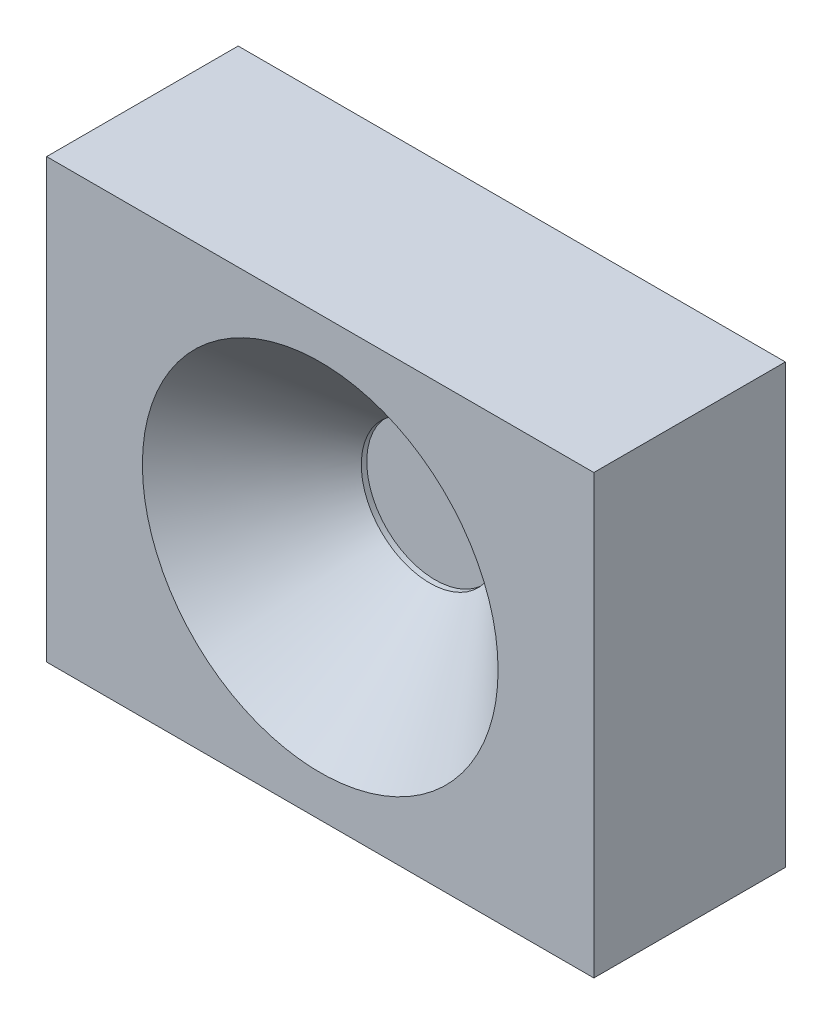
ISO-10303-21;
HEADER;
FILE_DESCRIPTION(('STEP AP214'),'2;1');
FILE_NAME('part.step','',(''),(''),'','','');
FILE_SCHEMA(('AUTOMOTIVE_DESIGN { 1 0 10303 214 1 1 1 1 }'));
ENDSEC;
DATA;
#1=APPLICATION_CONTEXT('core data for automotive mechanical design processes');
#2=APPLICATION_PROTOCOL_DEFINITION('international standard','automotive_design',2000,#1);
#3=PRODUCT_CONTEXT('',#1,'mechanical');
#4=PRODUCT('Part','Part','',(#3));
#5=PRODUCT_RELATED_PRODUCT_CATEGORY('part','',(#4));
#6=PRODUCT_DEFINITION_FORMATION('','',#4);
#7=PRODUCT_DEFINITION_CONTEXT('part definition',#1,'design');
#8=PRODUCT_DEFINITION('design','',#6,#7);
#9=PRODUCT_DEFINITION_SHAPE('','',#8);
#10=(LENGTH_UNIT() NAMED_UNIT(*) SI_UNIT(.MILLI.,.METRE.));
#11=(NAMED_UNIT(*) PLANE_ANGLE_UNIT() SI_UNIT($,.RADIAN.));
#12=(NAMED_UNIT(*) SI_UNIT($,.STERADIAN.) SOLID_ANGLE_UNIT());
#13=UNCERTAINTY_MEASURE_WITH_UNIT(LENGTH_MEASURE(1.E-05),#10,'distance_accuracy_value','');
#14=(GEOMETRIC_REPRESENTATION_CONTEXT(3) GLOBAL_UNCERTAINTY_ASSIGNED_CONTEXT((#13)) GLOBAL_UNIT_ASSIGNED_CONTEXT((#10,
#11,#12)) REPRESENTATION_CONTEXT('',''));
#15=CARTESIAN_POINT('',(0.,0.,0.));
#16=DIRECTION('',(0.,0.,1.));
#17=DIRECTION('',(1.,0.,0.));
#18=AXIS2_PLACEMENT_3D('',#15,#16,#17);
#19=CARTESIAN_POINT('',(16.252683353424,-4.898529243469,0.500000015786));
#20=DIRECTION('',(0.,0.,-1.));
#21=DIRECTION('',(0.,-1.,0.));
#22=AXIS2_PLACEMENT_3D('',#19,#20,#21);
#23=PLANE('',#22);
#24=CARTESIAN_POINT('',(16.252683353424,-4.898529243469,0.500000015786));
#25=DIRECTION('',(0.,0.,1.));
#26=DIRECTION('',(1.,0.,0.));
#27=AXIS2_PLACEMENT_3D('',#24,#25,#26);
#28=CIRCLE('',#27,0.325);
#29=CARTESIAN_POINT('',(16.577683353424,-4.898529243469,0.500000015786));
#30=VERTEX_POINT('',#29);
#31=EDGE_CURVE('E126',#30,#30,#28,.T.);
#32=ORIENTED_EDGE('',*,*,#31,.F.);
#33=EDGE_LOOP('',(#32));
#34=FACE_BOUND('',#33,.T.);
#35=DIRECTION('',(0.,1.,0.));
#36=VECTOR('',#35,1.);
#37=CARTESIAN_POINT('',(15.752683353424,-5.298529243469,0.500000015786));
#38=LINE('',#37,#36);
#39=CARTESIAN_POINT('',(15.752683353424,-5.298529243469,0.500000015786));
#40=VERTEX_POINT('',#39);
#41=CARTESIAN_POINT('',(15.752683353424,-4.498529243469,0.500000015786));
#42=VERTEX_POINT('',#41);
#43=EDGE_CURVE('E90',#40,#42,#38,.T.);
#44=ORIENTED_EDGE('',*,*,#43,.F.);
#45=DIRECTION('',(-1.,0.,0.));
#46=VECTOR('',#45,1.);
#47=CARTESIAN_POINT('',(16.752683353424,-5.298529243469,0.500000015786));
#48=LINE('',#47,#46);
#49=CARTESIAN_POINT('',(16.752683353424,-5.298529243469,0.500000015786));
#50=VERTEX_POINT('',#49);
#51=EDGE_CURVE('E107',#50,#40,#48,.T.);
#52=ORIENTED_EDGE('',*,*,#51,.F.);
#53=DIRECTION('',(0.,-1.,0.));
#54=VECTOR('',#53,1.);
#55=CARTESIAN_POINT('',(16.752683353424,-4.498529243469,0.500000015786));
#56=LINE('',#55,#54);
#57=CARTESIAN_POINT('',(16.752683353424,-4.498529243469,0.500000015786));
#58=VERTEX_POINT('',#57);
#59=EDGE_CURVE('E146',#58,#50,#56,.T.);
#60=ORIENTED_EDGE('',*,*,#59,.F.);
#61=DIRECTION('',(1.,0.,0.));
#62=VECTOR('',#61,1.);
#63=CARTESIAN_POINT('',(15.752683353424,-4.498529243469,0.500000015786));
#64=LINE('',#63,#62);
#65=EDGE_CURVE('E93',#42,#58,#64,.T.);
#66=ORIENTED_EDGE('',*,*,#65,.F.);
#67=EDGE_LOOP('',(#44,#52,#60,#66));
#68=FACE_BOUND('',#67,.T.);
#69=ADVANCED_FACE('F15',(#34,#68),#23,.F.);
#70=CARTESIAN_POINT('',(16.252683353424,-4.898529243469,0.300000015786));
#71=DIRECTION('',(0.,0.,1.));
#72=DIRECTION('',(1.,0.,0.));
#73=AXIS2_PLACEMENT_3D('',#70,#71,#72);
#74=CONICAL_SURFACE('',#73,0.125,0.785398163397);
#75=DIRECTION('',(-0.707106781186548,0.,-0.707106781186548));
#76=VECTOR('',#75,1.);
#77=CARTESIAN_POINT('',(16.377683353424,-4.898529243469,0.300000015786));
#78=LINE('',#77,#76);
#79=CARTESIAN_POINT('',(16.377683353424,-4.898529243469,0.300000015786));
#80=VERTEX_POINT('',#79);
#81=EDGE_CURVE('E94',#30,#80,#78,.T.);
#82=ORIENTED_EDGE('',*,*,#81,.F.);
#83=ORIENTED_EDGE('',*,*,#31,.T.);
#84=ORIENTED_EDGE('',*,*,#81,.T.);
#85=CARTESIAN_POINT('',(16.252683353424,-4.898529243469,0.300000015786));
#86=DIRECTION('',(0.,0.,1.));
#87=DIRECTION('',(1.,0.,0.));
#88=AXIS2_PLACEMENT_3D('',#85,#86,#87);
#89=CIRCLE('',#88,0.125);
#90=EDGE_CURVE('E111',#80,#80,#89,.T.);
#91=ORIENTED_EDGE('',*,*,#90,.F.);
#92=EDGE_LOOP('',(#82,#83,#84,#91));
#93=FACE_BOUND('',#92,.T.);
#94=ADVANCED_FACE('F165',(#93),#74,.F.);
#95=CARTESIAN_POINT('',(15.752683353424,-4.498529243469,0.150000015786));
#96=DIRECTION('',(0.,1.,0.));
#97=DIRECTION('',(1.,0.,0.));
#98=AXIS2_PLACEMENT_3D('',#95,#96,#97);
#99=PLANE('',#98);
#100=DIRECTION('',(0.,0.,1.));
#101=VECTOR('',#100,1.);
#102=CARTESIAN_POINT('',(15.752683353424,-4.498529243469,0.150000015786));
#103=LINE('',#102,#101);
#104=CARTESIAN_POINT('',(15.752683353424,-4.498529243469,0.150000015786));
#105=VERTEX_POINT('',#104);
#106=EDGE_CURVE('E76',#105,#42,#103,.T.);
#107=ORIENTED_EDGE('',*,*,#106,.T.);
#108=ORIENTED_EDGE('',*,*,#65,.T.);
#109=DIRECTION('',(0.,0.,1.));
#110=VECTOR('',#109,1.);
#111=CARTESIAN_POINT('',(16.752683353424,-4.498529243469,0.150000015786));
#112=LINE('',#111,#110);
#113=CARTESIAN_POINT('',(16.752683353424,-4.498529243469,0.150000015786));
#114=VERTEX_POINT('',#113);
#115=EDGE_CURVE('E19',#114,#58,#112,.T.);
#116=ORIENTED_EDGE('',*,*,#115,.F.);
#117=DIRECTION('',(1.,0.,0.));
#118=VECTOR('',#117,1.);
#119=CARTESIAN_POINT('',(15.752683353424,-4.498529243469,0.150000015786));
#120=LINE('',#119,#118);
#121=EDGE_CURVE('E73',#105,#114,#120,.T.);
#122=ORIENTED_EDGE('',*,*,#121,.F.);
#123=EDGE_LOOP('',(#107,#108,#116,#122));
#124=FACE_BOUND('',#123,.T.);
#125=ADVANCED_FACE('F17',(#124),#99,.T.);
#126=CARTESIAN_POINT('',(15.752683353424,-5.298529243469,0.150000015786));
#127=DIRECTION('',(-1.,0.,0.));
#128=DIRECTION('',(0.,0.,1.));
#129=AXIS2_PLACEMENT_3D('',#126,#127,#128);
#130=PLANE('',#129);
#131=DIRECTION('',(0.,0.,1.));
#132=VECTOR('',#131,1.);
#133=CARTESIAN_POINT('',(15.752683353424,-5.298529243469,0.150000015786));
#134=LINE('',#133,#132);
#135=CARTESIAN_POINT('',(15.752683353424,-5.298529243469,0.150000015786));
#136=VERTEX_POINT('',#135);
#137=EDGE_CURVE('E116',#136,#40,#134,.T.);
#138=ORIENTED_EDGE('',*,*,#137,.T.);
#139=ORIENTED_EDGE('',*,*,#43,.T.);
#140=ORIENTED_EDGE('',*,*,#106,.F.);
#141=DIRECTION('',(0.,1.,0.));
#142=VECTOR('',#141,1.);
#143=CARTESIAN_POINT('',(15.752683353424,-5.298529243469,0.150000015786));
#144=LINE('',#143,#142);
#145=EDGE_CURVE('E26',#136,#105,#144,.T.);
#146=ORIENTED_EDGE('',*,*,#145,.F.);
#147=EDGE_LOOP('',(#138,#139,#140,#146));
#148=FACE_BOUND('',#147,.T.);
#149=ADVANCED_FACE('F87',(#148),#130,.T.);
#150=CARTESIAN_POINT('',(16.752683353424,-4.498529243469,0.150000015786));
#151=DIRECTION('',(1.,0.,0.));
#152=DIRECTION('',(0.,1.,0.));
#153=AXIS2_PLACEMENT_3D('',#150,#151,#152);
#154=PLANE('',#153);
#155=ORIENTED_EDGE('',*,*,#115,.T.);
#156=ORIENTED_EDGE('',*,*,#59,.T.);
#157=DIRECTION('',(0.,0.,1.));
#158=VECTOR('',#157,1.);
#159=CARTESIAN_POINT('',(16.752683353424,-5.298529243469,0.150000015786));
#160=LINE('',#159,#158);
#161=CARTESIAN_POINT('',(16.752683353424,-5.298529243469,0.150000015786));
#162=VERTEX_POINT('',#161);
#163=EDGE_CURVE('E112',#162,#50,#160,.T.);
#164=ORIENTED_EDGE('',*,*,#163,.F.);
#165=DIRECTION('',(0.,-1.,0.));
#166=VECTOR('',#165,1.);
#167=CARTESIAN_POINT('',(16.752683353424,-4.498529243469,0.150000015786));
#168=LINE('',#167,#166);
#169=EDGE_CURVE('E82',#114,#162,#168,.T.);
#170=ORIENTED_EDGE('',*,*,#169,.F.);
#171=EDGE_LOOP('',(#155,#156,#164,#170));
#172=FACE_BOUND('',#171,.T.);
#173=ADVANCED_FACE('F145',(#172),#154,.T.);
#174=CARTESIAN_POINT('',(16.752683353424,-5.298529243469,0.150000015786));
#175=DIRECTION('',(0.,-1.,0.));
#176=DIRECTION('',(0.,0.,-1.));
#177=AXIS2_PLACEMENT_3D('',#174,#175,#176);
#178=PLANE('',#177);
#179=ORIENTED_EDGE('',*,*,#163,.T.);
#180=ORIENTED_EDGE('',*,*,#51,.T.);
#181=ORIENTED_EDGE('',*,*,#137,.F.);
#182=DIRECTION('',(-1.,0.,0.));
#183=VECTOR('',#182,1.);
#184=CARTESIAN_POINT('',(16.752683353424,-5.298529243469,0.150000015786));
#185=LINE('',#184,#183);
#186=EDGE_CURVE('E99',#162,#136,#185,.T.);
#187=ORIENTED_EDGE('',*,*,#186,.F.);
#188=EDGE_LOOP('',(#179,#180,#181,#187));
#189=FACE_BOUND('',#188,.T.);
#190=ADVANCED_FACE('F149',(#189),#178,.T.);
#191=CARTESIAN_POINT('',(16.252683353424,-4.898529243469,0.500000015786));
#192=DIRECTION('',(0.,0.,1.));
#193=DIRECTION('',(1.,0.,0.));
#194=AXIS2_PLACEMENT_3D('',#191,#192,#193);
#195=CYLINDRICAL_SURFACE('',#194,0.125);
#196=ORIENTED_EDGE('',*,*,#90,.T.);
#197=DIRECTION('',(0.,0.,-1.));
#198=VECTOR('',#197,1.);
#199=CARTESIAN_POINT('',(16.377683353424,-4.898529243469,0.500000015786));
#200=LINE('',#199,#198);
#201=CARTESIAN_POINT('',(16.377683353424,-4.898529243469,0.290000015786));
#202=VERTEX_POINT('',#201);
#203=EDGE_CURVE('E83',#80,#202,#200,.T.);
#204=ORIENTED_EDGE('',*,*,#203,.T.);
#205=CARTESIAN_POINT('',(16.252683353424,-4.898529243469,0.290000015786));
#206=DIRECTION('',(0.,0.,1.));
#207=DIRECTION('',(1.,0.,0.));
#208=AXIS2_PLACEMENT_3D('',#205,#206,#207);
#209=CIRCLE('',#208,0.125);
#210=EDGE_CURVE('E10',#202,#202,#209,.T.);
#211=ORIENTED_EDGE('',*,*,#210,.F.);
#212=ORIENTED_EDGE('',*,*,#203,.F.);
#213=EDGE_LOOP('',(#196,#204,#211,#212));
#214=FACE_BOUND('',#213,.T.);
#215=ADVANCED_FACE('F179',(#214),#195,.F.);
#216=CARTESIAN_POINT('',(16.252683353424,-4.898529243469,0.150000015786));
#217=DIRECTION('',(0.,0.,-1.));
#218=DIRECTION('',(0.,-1.,0.));
#219=AXIS2_PLACEMENT_3D('',#216,#217,#218);
#220=PLANE('',#219);
#221=ORIENTED_EDGE('',*,*,#121,.T.);
#222=ORIENTED_EDGE('',*,*,#169,.T.);
#223=ORIENTED_EDGE('',*,*,#186,.T.);
#224=ORIENTED_EDGE('',*,*,#145,.T.);
#225=EDGE_LOOP('',(#221,#222,#223,#224));
#226=FACE_BOUND('',#225,.T.);
#227=ADVANCED_FACE('F97',(#226),#220,.T.);
#228=CARTESIAN_POINT('',(16.252683353424,-4.898529243469,0.290000015786));
#229=DIRECTION('',(0.,0.,1.));
#230=DIRECTION('',(1.,0.,0.));
#231=AXIS2_PLACEMENT_3D('',#228,#229,#230);
#232=PLANE('',#231);
#233=ORIENTED_EDGE('',*,*,#210,.T.);
#234=EDGE_LOOP('',(#233));
#235=FACE_BOUND('',#234,.T.);
#236=ADVANCED_FACE('F175',(#235),#232,.T.);
#237=CLOSED_SHELL('',(#69,#94,#125,#149,#173,#190,#215,#227,#236));
#238=MANIFOLD_SOLID_BREP('B1',#237);
#239=ADVANCED_BREP_SHAPE_REPRESENTATION('',(#18,#238),#14);
#240=SHAPE_DEFINITION_REPRESENTATION(#9,#239);
ENDSEC;
END-ISO-10303-21;
